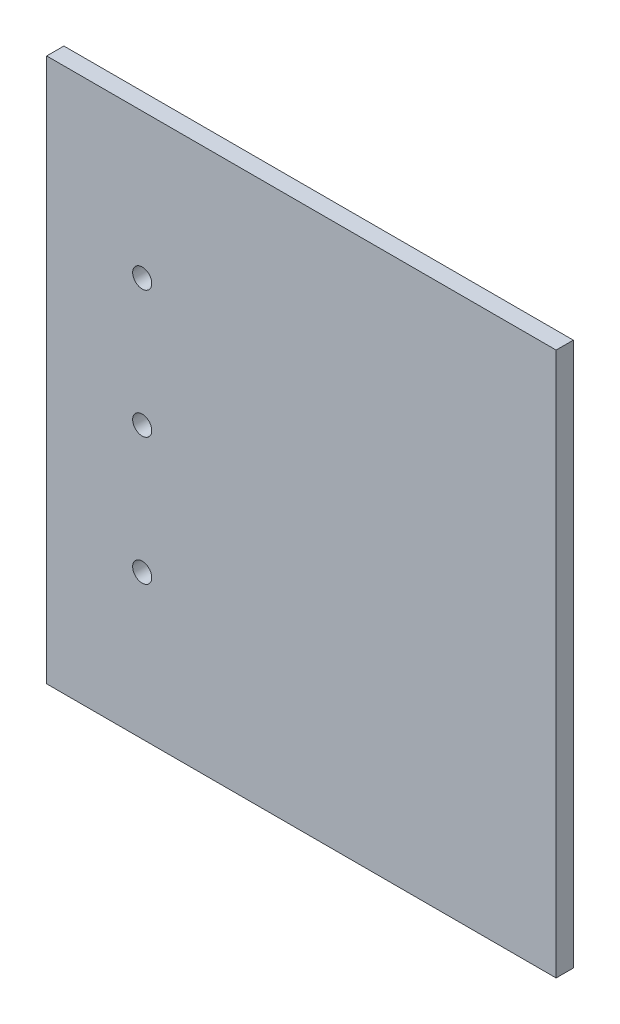
ISO-10303-21;
HEADER;
FILE_DESCRIPTION(('STEP AP214'),'2;1');
FILE_NAME('part.step','',(''),(''),'','','');
FILE_SCHEMA(('AUTOMOTIVE_DESIGN { 1 0 10303 214 1 1 1 1 }'));
ENDSEC;
DATA;
#1=APPLICATION_CONTEXT('core data for automotive mechanical design processes');
#2=APPLICATION_PROTOCOL_DEFINITION('international standard','automotive_design',2000,#1);
#3=PRODUCT_CONTEXT('',#1,'mechanical');
#4=PRODUCT('Part','Part','',(#3));
#5=PRODUCT_RELATED_PRODUCT_CATEGORY('part','',(#4));
#6=PRODUCT_DEFINITION_FORMATION('','',#4);
#7=PRODUCT_DEFINITION_CONTEXT('part definition',#1,'design');
#8=PRODUCT_DEFINITION('design','',#6,#7);
#9=PRODUCT_DEFINITION_SHAPE('','',#8);
#10=(LENGTH_UNIT() NAMED_UNIT(*) SI_UNIT(.MILLI.,.METRE.));
#11=(NAMED_UNIT(*) PLANE_ANGLE_UNIT() SI_UNIT($,.RADIAN.));
#12=(NAMED_UNIT(*) SI_UNIT($,.STERADIAN.) SOLID_ANGLE_UNIT());
#13=UNCERTAINTY_MEASURE_WITH_UNIT(LENGTH_MEASURE(1.E-05),#10,'distance_accuracy_value','');
#14=(GEOMETRIC_REPRESENTATION_CONTEXT(3) GLOBAL_UNCERTAINTY_ASSIGNED_CONTEXT((#13)) GLOBAL_UNIT_ASSIGNED_CONTEXT((#10,
#11,#12)) REPRESENTATION_CONTEXT('',''));
#15=CARTESIAN_POINT('',(0.,0.,0.));
#16=DIRECTION('',(0.,0.,1.));
#17=DIRECTION('',(1.,0.,0.));
#18=AXIS2_PLACEMENT_3D('',#15,#16,#17);
#19=CARTESIAN_POINT('',(-82.7,0.,2.7));
#20=DIRECTION('',(1.,0.,0.));
#21=DIRECTION('',(0.,0.,-1.));
#22=AXIS2_PLACEMENT_3D('',#19,#20,#21);
#23=PLANE('',#22);
#24=DIRECTION('',(0.,-1.,0.));
#25=VECTOR('',#24,1.);
#26=CARTESIAN_POINT('',(-82.7,0.,0.));
#27=LINE('',#26,#25);
#28=CARTESIAN_POINT('',(-82.7,85.4,0.));
#29=VERTEX_POINT('',#28);
#30=CARTESIAN_POINT('',(-82.7,0.,0.));
#31=VERTEX_POINT('',#30);
#32=EDGE_CURVE('E96',#29,#31,#27,.T.);
#33=ORIENTED_EDGE('',*,*,#32,.T.);
#34=DIRECTION('',(0.,0.,-1.));
#35=VECTOR('',#34,1.);
#36=CARTESIAN_POINT('',(-82.7,0.,2.7));
#37=LINE('',#36,#35);
#38=CARTESIAN_POINT('',(-82.7,0.,2.7));
#39=VERTEX_POINT('',#38);
#40=EDGE_CURVE('E11',#39,#31,#37,.T.);
#41=ORIENTED_EDGE('',*,*,#40,.F.);
#42=DIRECTION('',(0.,-1.,0.));
#43=VECTOR('',#42,1.);
#44=CARTESIAN_POINT('',(-82.7,0.,2.7));
#45=LINE('',#44,#43);
#46=CARTESIAN_POINT('',(-82.7,85.4,2.7));
#47=VERTEX_POINT('',#46);
#48=EDGE_CURVE('E84',#47,#39,#45,.T.);
#49=ORIENTED_EDGE('',*,*,#48,.F.);
#50=DIRECTION('',(0.,0.,-1.));
#51=VECTOR('',#50,1.);
#52=CARTESIAN_POINT('',(-82.7,85.4,2.7));
#53=LINE('',#52,#51);
#54=EDGE_CURVE('E92',#47,#29,#53,.T.);
#55=ORIENTED_EDGE('',*,*,#54,.T.);
#56=EDGE_LOOP('',(#33,#41,#49,#55));
#57=FACE_BOUND('',#56,.T.);
#58=ADVANCED_FACE('F33',(#57),#23,.F.);
#59=CARTESIAN_POINT('',(-82.7,0.,2.7));
#60=DIRECTION('',(0.,1.,0.));
#61=DIRECTION('',(0.,0.,1.));
#62=AXIS2_PLACEMENT_3D('',#59,#60,#61);
#63=PLANE('',#62);
#64=DIRECTION('',(1.,0.,0.));
#65=VECTOR('',#64,1.);
#66=CARTESIAN_POINT('',(-82.7,0.,0.));
#67=LINE('',#66,#65);
#68=CARTESIAN_POINT('',(-2.70000000000001,0.,0.));
#69=VERTEX_POINT('',#68);
#70=EDGE_CURVE('E88',#31,#69,#67,.T.);
#71=ORIENTED_EDGE('',*,*,#70,.T.);
#72=DIRECTION('',(0.,0.,-1.));
#73=VECTOR('',#72,1.);
#74=CARTESIAN_POINT('',(-2.70000000000001,0.,2.7));
#75=LINE('',#74,#73);
#76=CARTESIAN_POINT('',(-2.70000000000001,0.,2.7));
#77=VERTEX_POINT('',#76);
#78=EDGE_CURVE('E41',#77,#69,#75,.T.);
#79=ORIENTED_EDGE('',*,*,#78,.F.);
#80=DIRECTION('',(1.,0.,0.));
#81=VECTOR('',#80,1.);
#82=CARTESIAN_POINT('',(-82.7,0.,2.7));
#83=LINE('',#82,#81);
#84=EDGE_CURVE('E79',#39,#77,#83,.T.);
#85=ORIENTED_EDGE('',*,*,#84,.F.);
#86=ORIENTED_EDGE('',*,*,#40,.T.);
#87=EDGE_LOOP('',(#71,#79,#85,#86));
#88=FACE_BOUND('',#87,.T.);
#89=ADVANCED_FACE('F87',(#88),#63,.F.);
#90=CARTESIAN_POINT('',(-2.70000000000001,0.,2.7));
#91=DIRECTION('',(-1.,0.,0.));
#92=DIRECTION('',(0.,0.,1.));
#93=AXIS2_PLACEMENT_3D('',#90,#91,#92);
#94=PLANE('',#93);
#95=DIRECTION('',(0.,1.,0.));
#96=VECTOR('',#95,1.);
#97=CARTESIAN_POINT('',(-2.70000000000001,0.,0.));
#98=LINE('',#97,#96);
#99=CARTESIAN_POINT('',(-2.70000000000001,85.4,0.));
#100=VERTEX_POINT('',#99);
#101=EDGE_CURVE('E66',#69,#100,#98,.T.);
#102=ORIENTED_EDGE('',*,*,#101,.T.);
#103=DIRECTION('',(0.,0.,-1.));
#104=VECTOR('',#103,1.);
#105=CARTESIAN_POINT('',(-2.70000000000001,85.4,2.7));
#106=LINE('',#105,#104);
#107=CARTESIAN_POINT('',(-2.70000000000001,85.4,2.7));
#108=VERTEX_POINT('',#107);
#109=EDGE_CURVE('E89',#108,#100,#106,.T.);
#110=ORIENTED_EDGE('',*,*,#109,.F.);
#111=DIRECTION('',(0.,1.,0.));
#112=VECTOR('',#111,1.);
#113=CARTESIAN_POINT('',(-2.70000000000001,0.,2.7));
#114=LINE('',#113,#112);
#115=EDGE_CURVE('E82',#77,#108,#114,.T.);
#116=ORIENTED_EDGE('',*,*,#115,.F.);
#117=ORIENTED_EDGE('',*,*,#78,.T.);
#118=EDGE_LOOP('',(#102,#110,#116,#117));
#119=FACE_BOUND('',#118,.T.);
#120=ADVANCED_FACE('F90',(#119),#94,.F.);
#121=CARTESIAN_POINT('',(-82.7,85.4,2.7));
#122=DIRECTION('',(0.,-1.,0.));
#123=DIRECTION('',(0.,0.,-1.));
#124=AXIS2_PLACEMENT_3D('',#121,#122,#123);
#125=PLANE('',#124);
#126=DIRECTION('',(-1.,0.,0.));
#127=VECTOR('',#126,1.);
#128=CARTESIAN_POINT('',(-82.7,85.4,0.));
#129=LINE('',#128,#127);
#130=EDGE_CURVE('E72',#100,#29,#129,.T.);
#131=ORIENTED_EDGE('',*,*,#130,.T.);
#132=ORIENTED_EDGE('',*,*,#54,.F.);
#133=DIRECTION('',(-1.,0.,0.));
#134=VECTOR('',#133,1.);
#135=CARTESIAN_POINT('',(-82.7,85.4,2.7));
#136=LINE('',#135,#134);
#137=EDGE_CURVE('E49',#108,#47,#136,.T.);
#138=ORIENTED_EDGE('',*,*,#137,.F.);
#139=ORIENTED_EDGE('',*,*,#109,.T.);
#140=EDGE_LOOP('',(#131,#132,#138,#139));
#141=FACE_BOUND('',#140,.T.);
#142=ADVANCED_FACE('F104',(#141),#125,.F.);
#143=CARTESIAN_POINT('',(0.,0.,2.7));
#144=DIRECTION('',(0.,0.,-1.));
#145=DIRECTION('',(-1.,0.,0.));
#146=AXIS2_PLACEMENT_3D('',#143,#144,#145);
#147=PLANE('',#146);
#148=CARTESIAN_POINT('',(-67.7,62.7,2.7));
#149=DIRECTION('',(0.,0.,-1.));
#150=DIRECTION('',(-1.,0.,0.));
#151=AXIS2_PLACEMENT_3D('',#148,#149,#150);
#152=CIRCLE('',#151,1.5);
#153=CARTESIAN_POINT('',(-69.2,62.7,2.7));
#154=VERTEX_POINT('',#153);
#155=EDGE_CURVE('E119',#154,#154,#152,.T.);
#156=ORIENTED_EDGE('',*,*,#155,.T.);
#157=EDGE_LOOP('',(#156));
#158=FACE_BOUND('',#157,.T.);
#159=CARTESIAN_POINT('',(-67.7,22.7,2.7));
#160=DIRECTION('',(0.,0.,-1.));
#161=DIRECTION('',(-1.,0.,0.));
#162=AXIS2_PLACEMENT_3D('',#159,#160,#161);
#163=CIRCLE('',#162,1.5);
#164=CARTESIAN_POINT('',(-69.2,22.7,2.7));
#165=VERTEX_POINT('',#164);
#166=EDGE_CURVE('E113',#165,#165,#163,.T.);
#167=ORIENTED_EDGE('',*,*,#166,.T.);
#168=EDGE_LOOP('',(#167));
#169=FACE_BOUND('',#168,.T.);
#170=CARTESIAN_POINT('',(-67.7,42.7,2.7));
#171=DIRECTION('',(0.,0.,-1.));
#172=DIRECTION('',(-1.,0.,0.));
#173=AXIS2_PLACEMENT_3D('',#170,#171,#172);
#174=CIRCLE('',#173,1.5);
#175=CARTESIAN_POINT('',(-69.2,42.7,2.7));
#176=VERTEX_POINT('',#175);
#177=EDGE_CURVE('E99',#176,#176,#174,.T.);
#178=ORIENTED_EDGE('',*,*,#177,.T.);
#179=EDGE_LOOP('',(#178));
#180=FACE_BOUND('',#179,.T.);
#181=ORIENTED_EDGE('',*,*,#48,.T.);
#182=ORIENTED_EDGE('',*,*,#84,.T.);
#183=ORIENTED_EDGE('',*,*,#115,.T.);
#184=ORIENTED_EDGE('',*,*,#137,.T.);
#185=EDGE_LOOP('',(#181,#182,#183,#184));
#186=FACE_BOUND('',#185,.T.);
#187=ADVANCED_FACE('F80',(#158,#169,#180,#186),#147,.F.);
#188=CARTESIAN_POINT('',(0.,0.,0.));
#189=DIRECTION('',(0.,0.,-1.));
#190=DIRECTION('',(-1.,0.,0.));
#191=AXIS2_PLACEMENT_3D('',#188,#189,#190);
#192=PLANE('',#191);
#193=CARTESIAN_POINT('',(-67.7,62.7,0.));
#194=DIRECTION('',(0.,0.,-1.));
#195=DIRECTION('',(-1.,0.,0.));
#196=AXIS2_PLACEMENT_3D('',#193,#194,#195);
#197=CIRCLE('',#196,1.5);
#198=CARTESIAN_POINT('',(-69.2,62.7,0.));
#199=VERTEX_POINT('',#198);
#200=EDGE_CURVE('E116',#199,#199,#197,.T.);
#201=ORIENTED_EDGE('',*,*,#200,.F.);
#202=EDGE_LOOP('',(#201));
#203=FACE_BOUND('',#202,.T.);
#204=CARTESIAN_POINT('',(-67.7,22.7,0.));
#205=DIRECTION('',(0.,0.,-1.));
#206=DIRECTION('',(-1.,0.,0.));
#207=AXIS2_PLACEMENT_3D('',#204,#205,#206);
#208=CIRCLE('',#207,1.5);
#209=CARTESIAN_POINT('',(-69.2,22.7,0.));
#210=VERTEX_POINT('',#209);
#211=EDGE_CURVE('E122',#210,#210,#208,.T.);
#212=ORIENTED_EDGE('',*,*,#211,.F.);
#213=EDGE_LOOP('',(#212));
#214=FACE_BOUND('',#213,.T.);
#215=CARTESIAN_POINT('',(-67.7,42.7,0.));
#216=DIRECTION('',(0.,0.,-1.));
#217=DIRECTION('',(-1.,0.,0.));
#218=AXIS2_PLACEMENT_3D('',#215,#216,#217);
#219=CIRCLE('',#218,1.5);
#220=CARTESIAN_POINT('',(-69.2,42.7,0.));
#221=VERTEX_POINT('',#220);
#222=EDGE_CURVE('E110',#221,#221,#219,.T.);
#223=ORIENTED_EDGE('',*,*,#222,.F.);
#224=EDGE_LOOP('',(#223));
#225=FACE_BOUND('',#224,.T.);
#226=ORIENTED_EDGE('',*,*,#32,.F.);
#227=ORIENTED_EDGE('',*,*,#130,.F.);
#228=ORIENTED_EDGE('',*,*,#101,.F.);
#229=ORIENTED_EDGE('',*,*,#70,.F.);
#230=EDGE_LOOP('',(#226,#227,#228,#229));
#231=FACE_BOUND('',#230,.T.);
#232=ADVANCED_FACE('F107',(#203,#214,#225,#231),#192,.T.);
#233=CARTESIAN_POINT('',(-67.7,42.7,2.7));
#234=DIRECTION('',(0.,0.,-1.));
#235=DIRECTION('',(-1.,0.,0.));
#236=AXIS2_PLACEMENT_3D('',#233,#234,#235);
#237=CYLINDRICAL_SURFACE('',#236,1.5);
#238=CARTESIAN_POINT('',(-69.2,42.7,2.7));
#239=CARTESIAN_POINT('',(-69.2,42.7,2.671875));
#240=CARTESIAN_POINT('',(-69.2,42.7,2.64375));
#241=CARTESIAN_POINT('',(-69.2,42.7,2.5875));
#242=CARTESIAN_POINT('',(-69.2,42.7,2.559375));
#243=CARTESIAN_POINT('',(-69.2,42.7,2.503125));
#244=CARTESIAN_POINT('',(-69.2,42.7,2.475));
#245=CARTESIAN_POINT('',(-69.2,42.7,2.41875));
#246=CARTESIAN_POINT('',(-69.2,42.7,2.390625));
#247=CARTESIAN_POINT('',(-69.2,42.7,2.334375));
#248=CARTESIAN_POINT('',(-69.2,42.7,2.30625));
#249=CARTESIAN_POINT('',(-69.2,42.7,2.25));
#250=CARTESIAN_POINT('',(-69.2,42.7,2.221875));
#251=CARTESIAN_POINT('',(-69.2,42.7,2.165625));
#252=CARTESIAN_POINT('',(-69.2,42.7,2.1375));
#253=CARTESIAN_POINT('',(-69.2,42.7,2.08125));
#254=CARTESIAN_POINT('',(-69.2,42.7,2.053125));
#255=CARTESIAN_POINT('',(-69.2,42.7,1.996875));
#256=CARTESIAN_POINT('',(-69.2,42.7,1.96875));
#257=CARTESIAN_POINT('',(-69.2,42.7,1.9125));
#258=CARTESIAN_POINT('',(-69.2,42.7,1.884375));
#259=CARTESIAN_POINT('',(-69.2,42.7,1.828125));
#260=CARTESIAN_POINT('',(-69.2,42.7,1.8));
#261=CARTESIAN_POINT('',(-69.2,42.7,1.74375));
#262=CARTESIAN_POINT('',(-69.2,42.7,1.715625));
#263=CARTESIAN_POINT('',(-69.2,42.7,1.659375));
#264=CARTESIAN_POINT('',(-69.2,42.7,1.63125));
#265=CARTESIAN_POINT('',(-69.2,42.7,1.575));
#266=CARTESIAN_POINT('',(-69.2,42.7,1.546875));
#267=CARTESIAN_POINT('',(-69.2,42.7,1.490625));
#268=CARTESIAN_POINT('',(-69.2,42.7,1.4625));
#269=CARTESIAN_POINT('',(-69.2,42.7,1.40625));
#270=CARTESIAN_POINT('',(-69.2,42.7,1.378125));
#271=CARTESIAN_POINT('',(-69.2,42.7,1.321875));
#272=CARTESIAN_POINT('',(-69.2,42.7,1.29375));
#273=CARTESIAN_POINT('',(-69.2,42.7,1.2375));
#274=CARTESIAN_POINT('',(-69.2,42.7,1.209375));
#275=CARTESIAN_POINT('',(-69.2,42.7,1.153125));
#276=CARTESIAN_POINT('',(-69.2,42.7,1.125));
#277=CARTESIAN_POINT('',(-69.2,42.7,1.06875));
#278=CARTESIAN_POINT('',(-69.2,42.7,1.040625));
#279=CARTESIAN_POINT('',(-69.2,42.7,0.984375));
#280=CARTESIAN_POINT('',(-69.2,42.7,0.95625));
#281=CARTESIAN_POINT('',(-69.2,42.7,0.9));
#282=CARTESIAN_POINT('',(-69.2,42.7,0.871875000000001));
#283=CARTESIAN_POINT('',(-69.2,42.7,0.815625));
#284=CARTESIAN_POINT('',(-69.2,42.7,0.787500000000001));
#285=CARTESIAN_POINT('',(-69.2,42.7,0.731250000000001));
#286=CARTESIAN_POINT('',(-69.2,42.7,0.703125000000001));
#287=CARTESIAN_POINT('',(-69.2,42.7,0.646875000000001));
#288=CARTESIAN_POINT('',(-69.2,42.7,0.61875));
#289=CARTESIAN_POINT('',(-69.2,42.7,0.5625));
#290=CARTESIAN_POINT('',(-69.2,42.7,0.534375000000001));
#291=CARTESIAN_POINT('',(-69.2,42.7,0.478125000000001));
#292=CARTESIAN_POINT('',(-69.2,42.7,0.45));
#293=CARTESIAN_POINT('',(-69.2,42.7,0.39375));
#294=CARTESIAN_POINT('',(-69.2,42.7,0.365625));
#295=CARTESIAN_POINT('',(-69.2,42.7,0.309375));
#296=CARTESIAN_POINT('',(-69.2,42.7,0.28125));
#297=CARTESIAN_POINT('',(-69.2,42.7,0.225));
#298=CARTESIAN_POINT('',(-69.2,42.7,0.196875));
#299=CARTESIAN_POINT('',(-69.2,42.7,0.140625));
#300=CARTESIAN_POINT('',(-69.2,42.7,0.1125));
#301=CARTESIAN_POINT('',(-69.2,42.7,0.0562500000000003));
#302=CARTESIAN_POINT('',(-69.2,42.7,0.0281250000000003));
#303=CARTESIAN_POINT('',(-69.2,42.7,0.));
#304=B_SPLINE_CURVE_WITH_KNOTS('',3,(#238,#239,#240,#241,#242,#243,#244,#245,#246,#247,#248,
#249,#250,#251,#252,#253,#254,#255,#256,#257,#258,#259,#260,#261,#262,#263,#264,#265,#266,#267,
#268,#269,#270,#271,#272,#273,#274,#275,#276,#277,#278,#279,#280,#281,#282,#283,#284,#285,#286,
#287,#288,#289,#290,#291,#292,#293,#294,#295,#296,#297,#298,#299,#300,#301,#302,#303),
.UNSPECIFIED.,.F.,.F.,(4,2,2,2,2,2,2,2,2,2,2,2,2,2,2,2,2,2,2,2,2,2,2,2,2,2,2,2,2,2,2,2,4),(0.,
0.0843749999999998,0.16875,0.253125,0.3375,0.421875,0.50625,0.590625,0.675,0.759375,0.84375,
0.928125,1.0125,1.096875,1.18125,1.265625,1.35,1.434375,1.51875,1.603125,1.6875,1.771875,
1.85625,1.940625,2.025,2.109375,2.19375,2.278125,2.3625,2.446875,2.53125,2.615625,2.7),.UNSPECIFIED.);
#305=EDGE_CURVE('BSEAM134',#176,#221,#304,.T.);
#306=ORIENTED_EDGE('',*,*,#177,.F.);
#307=ORIENTED_EDGE('',*,*,#222,.T.);
#308=ORIENTED_EDGE('',*,*,#305,.T.);
#309=ORIENTED_EDGE('',*,*,#305,.F.);
#310=EDGE_LOOP('',(#306,#308,#307,#309));
#311=FACE_BOUND('',#310,.T.);
#312=ADVANCED_FACE('F134',(#311),#237,.F.);
#313=CARTESIAN_POINT('',(-67.7,22.7,2.7));
#314=DIRECTION('',(0.,0.,-1.));
#315=DIRECTION('',(-1.,0.,0.));
#316=AXIS2_PLACEMENT_3D('',#313,#314,#315);
#317=CYLINDRICAL_SURFACE('',#316,1.5);
#318=CARTESIAN_POINT('',(-69.2,22.7,2.7));
#319=CARTESIAN_POINT('',(-69.2,22.7,2.671875));
#320=CARTESIAN_POINT('',(-69.2,22.7,2.64375));
#321=CARTESIAN_POINT('',(-69.2,22.7,2.5875));
#322=CARTESIAN_POINT('',(-69.2,22.7,2.559375));
#323=CARTESIAN_POINT('',(-69.2,22.7,2.503125));
#324=CARTESIAN_POINT('',(-69.2,22.7,2.475));
#325=CARTESIAN_POINT('',(-69.2,22.7,2.41875));
#326=CARTESIAN_POINT('',(-69.2,22.7,2.390625));
#327=CARTESIAN_POINT('',(-69.2,22.7,2.334375));
#328=CARTESIAN_POINT('',(-69.2,22.7,2.30625));
#329=CARTESIAN_POINT('',(-69.2,22.7,2.25));
#330=CARTESIAN_POINT('',(-69.2,22.7,2.221875));
#331=CARTESIAN_POINT('',(-69.2,22.7,2.165625));
#332=CARTESIAN_POINT('',(-69.2,22.7,2.1375));
#333=CARTESIAN_POINT('',(-69.2,22.7,2.08125));
#334=CARTESIAN_POINT('',(-69.2,22.7,2.053125));
#335=CARTESIAN_POINT('',(-69.2,22.7,1.996875));
#336=CARTESIAN_POINT('',(-69.2,22.7,1.96875));
#337=CARTESIAN_POINT('',(-69.2,22.7,1.9125));
#338=CARTESIAN_POINT('',(-69.2,22.7,1.884375));
#339=CARTESIAN_POINT('',(-69.2,22.7,1.828125));
#340=CARTESIAN_POINT('',(-69.2,22.7,1.8));
#341=CARTESIAN_POINT('',(-69.2,22.7,1.74375));
#342=CARTESIAN_POINT('',(-69.2,22.7,1.715625));
#343=CARTESIAN_POINT('',(-69.2,22.7,1.659375));
#344=CARTESIAN_POINT('',(-69.2,22.7,1.63125));
#345=CARTESIAN_POINT('',(-69.2,22.7,1.575));
#346=CARTESIAN_POINT('',(-69.2,22.7,1.546875));
#347=CARTESIAN_POINT('',(-69.2,22.7,1.490625));
#348=CARTESIAN_POINT('',(-69.2,22.7,1.4625));
#349=CARTESIAN_POINT('',(-69.2,22.7,1.40625));
#350=CARTESIAN_POINT('',(-69.2,22.7,1.378125));
#351=CARTESIAN_POINT('',(-69.2,22.7,1.321875));
#352=CARTESIAN_POINT('',(-69.2,22.7,1.29375));
#353=CARTESIAN_POINT('',(-69.2,22.7,1.2375));
#354=CARTESIAN_POINT('',(-69.2,22.7,1.209375));
#355=CARTESIAN_POINT('',(-69.2,22.7,1.153125));
#356=CARTESIAN_POINT('',(-69.2,22.7,1.125));
#357=CARTESIAN_POINT('',(-69.2,22.7,1.06875));
#358=CARTESIAN_POINT('',(-69.2,22.7,1.040625));
#359=CARTESIAN_POINT('',(-69.2,22.7,0.984375));
#360=CARTESIAN_POINT('',(-69.2,22.7,0.95625));
#361=CARTESIAN_POINT('',(-69.2,22.7,0.9));
#362=CARTESIAN_POINT('',(-69.2,22.7,0.871875000000001));
#363=CARTESIAN_POINT('',(-69.2,22.7,0.815625));
#364=CARTESIAN_POINT('',(-69.2,22.7,0.787500000000001));
#365=CARTESIAN_POINT('',(-69.2,22.7,0.731250000000001));
#366=CARTESIAN_POINT('',(-69.2,22.7,0.703125000000001));
#367=CARTESIAN_POINT('',(-69.2,22.7,0.646875000000001));
#368=CARTESIAN_POINT('',(-69.2,22.7,0.61875));
#369=CARTESIAN_POINT('',(-69.2,22.7,0.5625));
#370=CARTESIAN_POINT('',(-69.2,22.7,0.534375000000001));
#371=CARTESIAN_POINT('',(-69.2,22.7,0.478125000000001));
#372=CARTESIAN_POINT('',(-69.2,22.7,0.45));
#373=CARTESIAN_POINT('',(-69.2,22.7,0.39375));
#374=CARTESIAN_POINT('',(-69.2,22.7,0.365625));
#375=CARTESIAN_POINT('',(-69.2,22.7,0.309375));
#376=CARTESIAN_POINT('',(-69.2,22.7,0.28125));
#377=CARTESIAN_POINT('',(-69.2,22.7,0.225));
#378=CARTESIAN_POINT('',(-69.2,22.7,0.196875));
#379=CARTESIAN_POINT('',(-69.2,22.7,0.140625));
#380=CARTESIAN_POINT('',(-69.2,22.7,0.1125));
#381=CARTESIAN_POINT('',(-69.2,22.7,0.0562500000000003));
#382=CARTESIAN_POINT('',(-69.2,22.7,0.0281250000000003));
#383=CARTESIAN_POINT('',(-69.2,22.7,0.));
#384=B_SPLINE_CURVE_WITH_KNOTS('',3,(#318,#319,#320,#321,#322,#323,#324,#325,#326,#327,#328,
#329,#330,#331,#332,#333,#334,#335,#336,#337,#338,#339,#340,#341,#342,#343,#344,#345,#346,#347,
#348,#349,#350,#351,#352,#353,#354,#355,#356,#357,#358,#359,#360,#361,#362,#363,#364,#365,#366,
#367,#368,#369,#370,#371,#372,#373,#374,#375,#376,#377,#378,#379,#380,#381,#382,#383),
.UNSPECIFIED.,.F.,.F.,(4,2,2,2,2,2,2,2,2,2,2,2,2,2,2,2,2,2,2,2,2,2,2,2,2,2,2,2,2,2,2,2,4),(0.,
0.0843749999999998,0.16875,0.253125,0.3375,0.421875,0.50625,0.590625,0.675,0.759375,0.84375,
0.928125,1.0125,1.096875,1.18125,1.265625,1.35,1.434375,1.51875,1.603125,1.6875,1.771875,
1.85625,1.940625,2.025,2.109375,2.19375,2.278125,2.3625,2.446875,2.53125,2.615625,2.7),.UNSPECIFIED.);
#385=EDGE_CURVE('BSEAM130',#165,#210,#384,.T.);
#386=ORIENTED_EDGE('',*,*,#166,.F.);
#387=ORIENTED_EDGE('',*,*,#211,.T.);
#388=ORIENTED_EDGE('',*,*,#385,.T.);
#389=ORIENTED_EDGE('',*,*,#385,.F.);
#390=EDGE_LOOP('',(#386,#388,#387,#389));
#391=FACE_BOUND('',#390,.T.);
#392=ADVANCED_FACE('F130',(#391),#317,.F.);
#393=CARTESIAN_POINT('',(-67.7,62.7,2.7));
#394=DIRECTION('',(0.,0.,-1.));
#395=DIRECTION('',(-1.,0.,0.));
#396=AXIS2_PLACEMENT_3D('',#393,#394,#395);
#397=CYLINDRICAL_SURFACE('',#396,1.5);
#398=CARTESIAN_POINT('',(-69.2,62.7,2.7));
#399=CARTESIAN_POINT('',(-69.2,62.7,2.671875));
#400=CARTESIAN_POINT('',(-69.2,62.7,2.64375));
#401=CARTESIAN_POINT('',(-69.2,62.7,2.5875));
#402=CARTESIAN_POINT('',(-69.2,62.7,2.559375));
#403=CARTESIAN_POINT('',(-69.2,62.7,2.503125));
#404=CARTESIAN_POINT('',(-69.2,62.7,2.475));
#405=CARTESIAN_POINT('',(-69.2,62.7,2.41875));
#406=CARTESIAN_POINT('',(-69.2,62.7,2.390625));
#407=CARTESIAN_POINT('',(-69.2,62.7,2.334375));
#408=CARTESIAN_POINT('',(-69.2,62.7,2.30625));
#409=CARTESIAN_POINT('',(-69.2,62.7,2.25));
#410=CARTESIAN_POINT('',(-69.2,62.7,2.221875));
#411=CARTESIAN_POINT('',(-69.2,62.7,2.165625));
#412=CARTESIAN_POINT('',(-69.2,62.7,2.1375));
#413=CARTESIAN_POINT('',(-69.2,62.7,2.08125));
#414=CARTESIAN_POINT('',(-69.2,62.7,2.053125));
#415=CARTESIAN_POINT('',(-69.2,62.7,1.996875));
#416=CARTESIAN_POINT('',(-69.2,62.7,1.96875));
#417=CARTESIAN_POINT('',(-69.2,62.7,1.9125));
#418=CARTESIAN_POINT('',(-69.2,62.7,1.884375));
#419=CARTESIAN_POINT('',(-69.2,62.7,1.828125));
#420=CARTESIAN_POINT('',(-69.2,62.7,1.8));
#421=CARTESIAN_POINT('',(-69.2,62.7,1.74375));
#422=CARTESIAN_POINT('',(-69.2,62.7,1.715625));
#423=CARTESIAN_POINT('',(-69.2,62.7,1.659375));
#424=CARTESIAN_POINT('',(-69.2,62.7,1.63125));
#425=CARTESIAN_POINT('',(-69.2,62.7,1.575));
#426=CARTESIAN_POINT('',(-69.2,62.7,1.546875));
#427=CARTESIAN_POINT('',(-69.2,62.7,1.490625));
#428=CARTESIAN_POINT('',(-69.2,62.7,1.4625));
#429=CARTESIAN_POINT('',(-69.2,62.7,1.40625));
#430=CARTESIAN_POINT('',(-69.2,62.7,1.378125));
#431=CARTESIAN_POINT('',(-69.2,62.7,1.321875));
#432=CARTESIAN_POINT('',(-69.2,62.7,1.29375));
#433=CARTESIAN_POINT('',(-69.2,62.7,1.2375));
#434=CARTESIAN_POINT('',(-69.2,62.7,1.209375));
#435=CARTESIAN_POINT('',(-69.2,62.7,1.153125));
#436=CARTESIAN_POINT('',(-69.2,62.7,1.125));
#437=CARTESIAN_POINT('',(-69.2,62.7,1.06875));
#438=CARTESIAN_POINT('',(-69.2,62.7,1.040625));
#439=CARTESIAN_POINT('',(-69.2,62.7,0.984375));
#440=CARTESIAN_POINT('',(-69.2,62.7,0.95625));
#441=CARTESIAN_POINT('',(-69.2,62.7,0.9));
#442=CARTESIAN_POINT('',(-69.2,62.7,0.871875000000001));
#443=CARTESIAN_POINT('',(-69.2,62.7,0.815625));
#444=CARTESIAN_POINT('',(-69.2,62.7,0.787500000000001));
#445=CARTESIAN_POINT('',(-69.2,62.7,0.731250000000001));
#446=CARTESIAN_POINT('',(-69.2,62.7,0.703125000000001));
#447=CARTESIAN_POINT('',(-69.2,62.7,0.646875000000001));
#448=CARTESIAN_POINT('',(-69.2,62.7,0.61875));
#449=CARTESIAN_POINT('',(-69.2,62.7,0.5625));
#450=CARTESIAN_POINT('',(-69.2,62.7,0.534375000000001));
#451=CARTESIAN_POINT('',(-69.2,62.7,0.478125000000001));
#452=CARTESIAN_POINT('',(-69.2,62.7,0.45));
#453=CARTESIAN_POINT('',(-69.2,62.7,0.39375));
#454=CARTESIAN_POINT('',(-69.2,62.7,0.365625));
#455=CARTESIAN_POINT('',(-69.2,62.7,0.309375));
#456=CARTESIAN_POINT('',(-69.2,62.7,0.28125));
#457=CARTESIAN_POINT('',(-69.2,62.7,0.225));
#458=CARTESIAN_POINT('',(-69.2,62.7,0.196875));
#459=CARTESIAN_POINT('',(-69.2,62.7,0.140625));
#460=CARTESIAN_POINT('',(-69.2,62.7,0.1125));
#461=CARTESIAN_POINT('',(-69.2,62.7,0.0562500000000003));
#462=CARTESIAN_POINT('',(-69.2,62.7,0.0281250000000003));
#463=CARTESIAN_POINT('',(-69.2,62.7,0.));
#464=B_SPLINE_CURVE_WITH_KNOTS('',3,(#398,#399,#400,#401,#402,#403,#404,#405,#406,#407,#408,
#409,#410,#411,#412,#413,#414,#415,#416,#417,#418,#419,#420,#421,#422,#423,#424,#425,#426,#427,
#428,#429,#430,#431,#432,#433,#434,#435,#436,#437,#438,#439,#440,#441,#442,#443,#444,#445,#446,
#447,#448,#449,#450,#451,#452,#453,#454,#455,#456,#457,#458,#459,#460,#461,#462,#463),
.UNSPECIFIED.,.F.,.F.,(4,2,2,2,2,2,2,2,2,2,2,2,2,2,2,2,2,2,2,2,2,2,2,2,2,2,2,2,2,2,2,2,4),(0.,
0.0843749999999998,0.16875,0.253125,0.3375,0.421875,0.50625,0.590625,0.675,0.759375,0.84375,
0.928125,1.0125,1.096875,1.18125,1.265625,1.35,1.434375,1.51875,1.603125,1.6875,1.771875,
1.85625,1.940625,2.025,2.109375,2.19375,2.278125,2.3625,2.446875,2.53125,2.615625,2.7),.UNSPECIFIED.);
#465=EDGE_CURVE('BSEAM133',#154,#199,#464,.T.);
#466=ORIENTED_EDGE('',*,*,#155,.F.);
#467=ORIENTED_EDGE('',*,*,#200,.T.);
#468=ORIENTED_EDGE('',*,*,#465,.T.);
#469=ORIENTED_EDGE('',*,*,#465,.F.);
#470=EDGE_LOOP('',(#466,#468,#467,#469));
#471=FACE_BOUND('',#470,.T.);
#472=ADVANCED_FACE('F133',(#471),#397,.F.);
#473=CLOSED_SHELL('',(#58,#89,#120,#142,#187,#232,#312,#392,#472));
#474=MANIFOLD_SOLID_BREP('B2',#473);
#475=ADVANCED_BREP_SHAPE_REPRESENTATION('',(#18,#474),#14);
#476=SHAPE_DEFINITION_REPRESENTATION(#9,#475);
ENDSEC;
END-ISO-10303-21;
